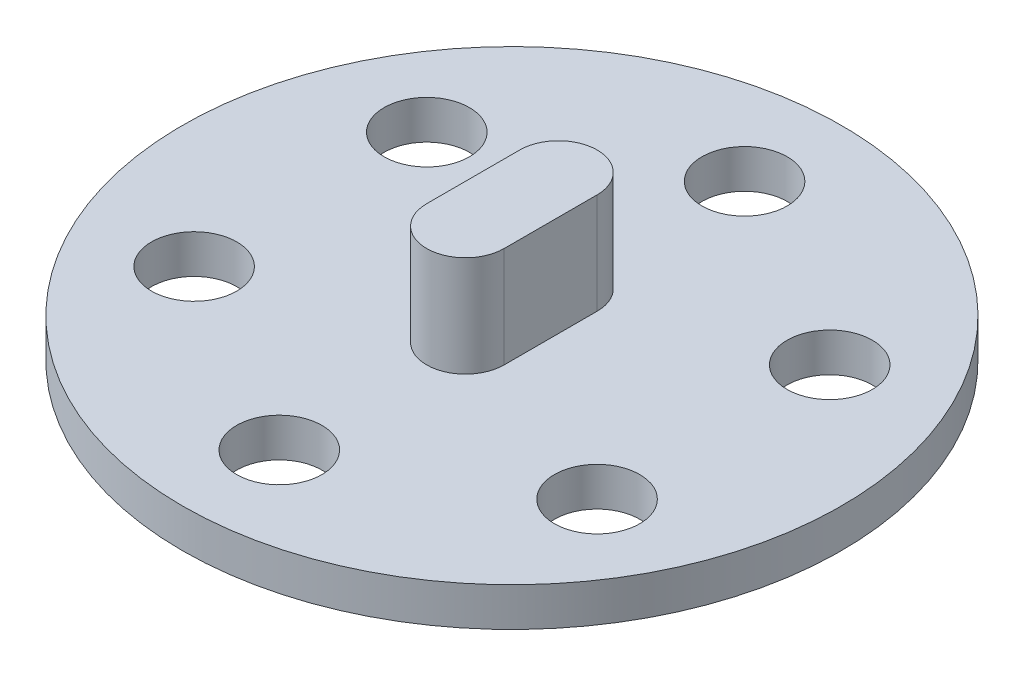
ISO-10303-21;
HEADER;
FILE_DESCRIPTION(('STEP AP214'),'2;1');
FILE_NAME('part.step','',(''),(''),'','','');
FILE_SCHEMA(('AUTOMOTIVE_DESIGN { 1 0 10303 214 1 1 1 1 }'));
ENDSEC;
DATA;
#1=APPLICATION_CONTEXT('core data for automotive mechanical design processes');
#2=APPLICATION_PROTOCOL_DEFINITION('international standard','automotive_design',2000,#1);
#3=PRODUCT_CONTEXT('',#1,'mechanical');
#4=PRODUCT('Part','Part','',(#3));
#5=PRODUCT_RELATED_PRODUCT_CATEGORY('part','',(#4));
#6=PRODUCT_DEFINITION_FORMATION('','',#4);
#7=PRODUCT_DEFINITION_CONTEXT('part definition',#1,'design');
#8=PRODUCT_DEFINITION('design','',#6,#7);
#9=PRODUCT_DEFINITION_SHAPE('','',#8);
#10=(LENGTH_UNIT() NAMED_UNIT(*) SI_UNIT(.MILLI.,.METRE.));
#11=(NAMED_UNIT(*) PLANE_ANGLE_UNIT() SI_UNIT($,.RADIAN.));
#12=(NAMED_UNIT(*) SI_UNIT($,.STERADIAN.) SOLID_ANGLE_UNIT());
#13=UNCERTAINTY_MEASURE_WITH_UNIT(LENGTH_MEASURE(1.E-05),#10,'distance_accuracy_value','');
#14=(GEOMETRIC_REPRESENTATION_CONTEXT(3) GLOBAL_UNCERTAINTY_ASSIGNED_CONTEXT((#13)) GLOBAL_UNIT_ASSIGNED_CONTEXT((#10,
#11,#12)) REPRESENTATION_CONTEXT('',''));
#15=CARTESIAN_POINT('',(0.,0.,0.));
#16=DIRECTION('',(0.,0.,1.));
#17=DIRECTION('',(1.,0.,0.));
#18=AXIS2_PLACEMENT_3D('',#15,#16,#17);
#19=CARTESIAN_POINT('',(0.,5.,0.));
#20=DIRECTION('',(0.,1.,0.));
#21=DIRECTION('',(0.,0.,1.));
#22=AXIS2_PLACEMENT_3D('',#19,#20,#21);
#23=PLANE('',#22);
#24=CARTESIAN_POINT('',(3.61340512615863E-12,5.,29.9999999999973));
#25=DIRECTION('',(0.,1.,0.));
#26=DIRECTION('',(0.,0.,1.));
#27=AXIS2_PLACEMENT_3D('',#24,#25,#26);
#28=CIRCLE('',#27,5.5);
#29=CARTESIAN_POINT('',(3.61340512615863E-12,5.,35.4999999999973));
#30=VERTEX_POINT('',#29);
#31=EDGE_CURVE('E141',#30,#30,#28,.T.);
#32=ORIENTED_EDGE('',*,*,#31,.F.);
#33=EDGE_LOOP('',(#32));
#34=FACE_BOUND('',#33,.T.);
#35=CARTESIAN_POINT('',(25.9807621135322,5.,-15.0000000000036));
#36=DIRECTION('',(0.,1.,0.));
#37=DIRECTION('',(0.,0.,1.));
#38=AXIS2_PLACEMENT_3D('',#35,#36,#37);
#39=CIRCLE('',#38,5.5);
#40=CARTESIAN_POINT('',(25.9807621135322,5.,-9.50000000000357));
#41=VERTEX_POINT('',#40);
#42=EDGE_CURVE('E157',#41,#41,#39,.T.);
#43=ORIENTED_EDGE('',*,*,#42,.F.);
#44=EDGE_LOOP('',(#43));
#45=FACE_BOUND('',#44,.T.);
#46=CARTESIAN_POINT('',(-25.9807621135326,5.,-14.9999999999996));
#47=DIRECTION('',(0.,1.,0.));
#48=DIRECTION('',(0.,0.,1.));
#49=AXIS2_PLACEMENT_3D('',#46,#47,#48);
#50=CIRCLE('',#49,5.5);
#51=CARTESIAN_POINT('',(-25.9807621135326,5.,-9.49999999999957));
#52=VERTEX_POINT('',#51);
#53=EDGE_CURVE('E173',#52,#52,#50,.T.);
#54=ORIENTED_EDGE('',*,*,#53,.F.);
#55=EDGE_LOOP('',(#54));
#56=FACE_BOUND('',#55,.T.);
#57=CARTESIAN_POINT('',(0.,5.,0.));
#58=DIRECTION('',(0.,1.,0.));
#59=DIRECTION('',(0.,0.,1.));
#60=AXIS2_PLACEMENT_3D('',#57,#58,#59);
#61=CIRCLE('',#60,42.5);
#62=CARTESIAN_POINT('',(0.,5.,42.5));
#63=VERTEX_POINT('',#62);
#64=EDGE_CURVE('E11',#63,#63,#61,.T.);
#65=ORIENTED_EDGE('',*,*,#64,.T.);
#66=EDGE_LOOP('',(#65));
#67=FACE_BOUND('',#66,.T.);
#68=CARTESIAN_POINT('',(-1.44883492865421E-12,5.,-30.0000000000009));
#69=DIRECTION('',(0.,1.,0.));
#70=DIRECTION('',(0.,0.,1.));
#71=AXIS2_PLACEMENT_3D('',#68,#69,#70);
#72=CIRCLE('',#71,5.5);
#73=CARTESIAN_POINT('',(-1.44883492865421E-12,5.,-24.5000000000009));
#74=VERTEX_POINT('',#73);
#75=EDGE_CURVE('E165',#74,#74,#72,.T.);
#76=ORIENTED_EDGE('',*,*,#75,.F.);
#77=EDGE_LOOP('',(#76));
#78=FACE_BOUND('',#77,.T.);
#79=CARTESIAN_POINT('',(25.9807621135347,5.,14.9999999999955));
#80=DIRECTION('',(0.,1.,0.));
#81=DIRECTION('',(0.,0.,1.));
#82=AXIS2_PLACEMENT_3D('',#79,#80,#81);
#83=CIRCLE('',#82,5.5);
#84=CARTESIAN_POINT('',(25.9807621135347,5.,20.4999999999955));
#85=VERTEX_POINT('',#84);
#86=EDGE_CURVE('E149',#85,#85,#83,.T.);
#87=ORIENTED_EDGE('',*,*,#86,.F.);
#88=EDGE_LOOP('',(#87));
#89=FACE_BOUND('',#88,.T.);
#90=CARTESIAN_POINT('',(-25.98076211353,5.,14.9999999999999));
#91=DIRECTION('',(0.,1.,0.));
#92=DIRECTION('',(0.,0.,1.));
#93=AXIS2_PLACEMENT_3D('',#90,#91,#92);
#94=CIRCLE('',#93,5.5);
#95=CARTESIAN_POINT('',(-25.98076211353,5.,20.4999999999999));
#96=VERTEX_POINT('',#95);
#97=EDGE_CURVE('E133',#96,#96,#94,.T.);
#98=ORIENTED_EDGE('',*,*,#97,.F.);
#99=EDGE_LOOP('',(#98));
#100=FACE_BOUND('',#99,.T.);
#101=DIRECTION('',(0.,0.,-1.));
#102=VECTOR('',#101,1.);
#103=CARTESIAN_POINT('',(5.,5.,6.));
#104=LINE('',#103,#102);
#105=CARTESIAN_POINT('',(5.,5.,6.));
#106=VERTEX_POINT('',#105);
#107=CARTESIAN_POINT('',(4.99999999999999,5.,-6.));
#108=VERTEX_POINT('',#107);
#109=EDGE_CURVE('E101',#106,#108,#104,.T.);
#110=ORIENTED_EDGE('',*,*,#109,.F.);
#111=CARTESIAN_POINT('',(0.,5.,6.));
#112=DIRECTION('',(0.,1.,0.));
#113=DIRECTION('',(0.,0.,1.));
#114=AXIS2_PLACEMENT_3D('',#111,#112,#113);
#115=CIRCLE('',#114,5.);
#116=CARTESIAN_POINT('',(-5.,5.,6.));
#117=VERTEX_POINT('',#116);
#118=EDGE_CURVE('E115',#117,#106,#115,.T.);
#119=ORIENTED_EDGE('',*,*,#118,.F.);
#120=DIRECTION('',(0.,0.,1.));
#121=VECTOR('',#120,1.);
#122=CARTESIAN_POINT('',(-5.,5.,6.));
#123=LINE('',#122,#121);
#124=CARTESIAN_POINT('',(-5.,5.,-6.));
#125=VERTEX_POINT('',#124);
#126=EDGE_CURVE('E81',#125,#117,#123,.T.);
#127=ORIENTED_EDGE('',*,*,#126,.F.);
#128=CARTESIAN_POINT('',(0.,5.,-6.));
#129=DIRECTION('',(0.,1.,0.));
#130=DIRECTION('',(0.,0.,1.));
#131=AXIS2_PLACEMENT_3D('',#128,#129,#130);
#132=CIRCLE('',#131,5.);
#133=EDGE_CURVE('E121',#108,#125,#132,.T.);
#134=ORIENTED_EDGE('',*,*,#133,.F.);
#135=EDGE_LOOP('',(#110,#119,#127,#134));
#136=FACE_BOUND('',#135,.T.);
#137=ADVANCED_FACE('F43',(#34,#45,#56,#67,#78,#89,#100,#136),#23,.T.);
#138=CARTESIAN_POINT('',(0.,0.,0.));
#139=DIRECTION('',(0.,1.,0.));
#140=DIRECTION('',(0.,0.,1.));
#141=AXIS2_PLACEMENT_3D('',#138,#139,#140);
#142=PLANE('',#141);
#143=CARTESIAN_POINT('',(0.,0.,0.));
#144=DIRECTION('',(0.,1.,0.));
#145=DIRECTION('',(0.,0.,1.));
#146=AXIS2_PLACEMENT_3D('',#143,#144,#145);
#147=CIRCLE('',#146,42.5);
#148=CARTESIAN_POINT('',(0.,0.,42.5));
#149=VERTEX_POINT('',#148);
#150=EDGE_CURVE('E47',#149,#149,#147,.T.);
#151=ORIENTED_EDGE('',*,*,#150,.F.);
#152=EDGE_LOOP('',(#151));
#153=FACE_BOUND('',#152,.T.);
#154=CARTESIAN_POINT('',(-25.9807621135326,0.,-14.9999999999996));
#155=DIRECTION('',(0.,1.,0.));
#156=DIRECTION('',(0.,0.,1.));
#157=AXIS2_PLACEMENT_3D('',#154,#155,#156);
#158=CIRCLE('',#157,5.5);
#159=CARTESIAN_POINT('',(-25.9807621135326,0.,-9.49999999999957));
#160=VERTEX_POINT('',#159);
#161=EDGE_CURVE('E169',#160,#160,#158,.T.);
#162=ORIENTED_EDGE('',*,*,#161,.T.);
#163=EDGE_LOOP('',(#162));
#164=FACE_BOUND('',#163,.T.);
#165=CARTESIAN_POINT('',(-1.44883492865421E-12,0.,-30.0000000000009));
#166=DIRECTION('',(0.,1.,0.));
#167=DIRECTION('',(0.,0.,1.));
#168=AXIS2_PLACEMENT_3D('',#165,#166,#167);
#169=CIRCLE('',#168,5.5);
#170=CARTESIAN_POINT('',(-1.44883492865421E-12,0.,-24.5000000000009));
#171=VERTEX_POINT('',#170);
#172=EDGE_CURVE('E161',#171,#171,#169,.T.);
#173=ORIENTED_EDGE('',*,*,#172,.T.);
#174=EDGE_LOOP('',(#173));
#175=FACE_BOUND('',#174,.T.);
#176=CARTESIAN_POINT('',(25.9807621135322,0.,-15.0000000000036));
#177=DIRECTION('',(0.,1.,0.));
#178=DIRECTION('',(0.,0.,1.));
#179=AXIS2_PLACEMENT_3D('',#176,#177,#178);
#180=CIRCLE('',#179,5.5);
#181=CARTESIAN_POINT('',(25.9807621135322,0.,-9.50000000000357));
#182=VERTEX_POINT('',#181);
#183=EDGE_CURVE('E153',#182,#182,#180,.T.);
#184=ORIENTED_EDGE('',*,*,#183,.T.);
#185=EDGE_LOOP('',(#184));
#186=FACE_BOUND('',#185,.T.);
#187=CARTESIAN_POINT('',(25.9807621135347,0.,14.9999999999955));
#188=DIRECTION('',(0.,1.,0.));
#189=DIRECTION('',(0.,0.,1.));
#190=AXIS2_PLACEMENT_3D('',#187,#188,#189);
#191=CIRCLE('',#190,5.5);
#192=CARTESIAN_POINT('',(25.9807621135347,0.,20.4999999999955));
#193=VERTEX_POINT('',#192);
#194=EDGE_CURVE('E145',#193,#193,#191,.T.);
#195=ORIENTED_EDGE('',*,*,#194,.T.);
#196=EDGE_LOOP('',(#195));
#197=FACE_BOUND('',#196,.T.);
#198=CARTESIAN_POINT('',(3.61340512615863E-12,0.,29.9999999999973));
#199=DIRECTION('',(0.,1.,0.));
#200=DIRECTION('',(0.,0.,1.));
#201=AXIS2_PLACEMENT_3D('',#198,#199,#200);
#202=CIRCLE('',#201,5.5);
#203=CARTESIAN_POINT('',(3.61340512615863E-12,0.,35.4999999999973));
#204=VERTEX_POINT('',#203);
#205=EDGE_CURVE('E137',#204,#204,#202,.T.);
#206=ORIENTED_EDGE('',*,*,#205,.T.);
#207=EDGE_LOOP('',(#206));
#208=FACE_BOUND('',#207,.T.);
#209=CARTESIAN_POINT('',(-25.98076211353,0.,14.9999999999999));
#210=DIRECTION('',(0.,1.,0.));
#211=DIRECTION('',(0.,0.,1.));
#212=AXIS2_PLACEMENT_3D('',#209,#210,#211);
#213=CIRCLE('',#212,5.5);
#214=CARTESIAN_POINT('',(-25.98076211353,0.,20.4999999999999));
#215=VERTEX_POINT('',#214);
#216=EDGE_CURVE('E132',#215,#215,#213,.T.);
#217=ORIENTED_EDGE('',*,*,#216,.T.);
#218=EDGE_LOOP('',(#217));
#219=FACE_BOUND('',#218,.T.);
#220=ADVANCED_FACE('F181',(#153,#164,#175,#186,#197,#208,#219),#142,.F.);
#221=CARTESIAN_POINT('',(0.,5.,0.));
#222=DIRECTION('',(0.,-1.,0.));
#223=DIRECTION('',(0.,0.,-1.));
#224=AXIS2_PLACEMENT_3D('',#221,#222,#223);
#225=CYLINDRICAL_SURFACE('',#224,42.5);
#226=ORIENTED_EDGE('',*,*,#64,.F.);
#227=EDGE_LOOP('',(#226));
#228=FACE_BOUND('',#227,.T.);
#229=ORIENTED_EDGE('',*,*,#150,.T.);
#230=EDGE_LOOP('',(#229));
#231=FACE_BOUND('',#230,.T.);
#232=ADVANCED_FACE('F45',(#228,#231),#225,.T.);
#233=CARTESIAN_POINT('',(-25.9807621135326,5.,-14.9999999999996));
#234=DIRECTION('',(0.,-1.,0.));
#235=DIRECTION('',(0.,0.,-1.));
#236=AXIS2_PLACEMENT_3D('',#233,#234,#235);
#237=CYLINDRICAL_SURFACE('',#236,5.5);
#238=ORIENTED_EDGE('',*,*,#53,.T.);
#239=EDGE_LOOP('',(#238));
#240=FACE_BOUND('',#239,.T.);
#241=ORIENTED_EDGE('',*,*,#161,.F.);
#242=EDGE_LOOP('',(#241));
#243=FACE_BOUND('',#242,.T.);
#244=ADVANCED_FACE('F184',(#240,#243),#237,.F.);
#245=CARTESIAN_POINT('',(-1.44883492865421E-12,5.,-30.0000000000009));
#246=DIRECTION('',(0.,-1.,0.));
#247=DIRECTION('',(0.,0.,-1.));
#248=AXIS2_PLACEMENT_3D('',#245,#246,#247);
#249=CYLINDRICAL_SURFACE('',#248,5.5);
#250=ORIENTED_EDGE('',*,*,#75,.T.);
#251=EDGE_LOOP('',(#250));
#252=FACE_BOUND('',#251,.T.);
#253=ORIENTED_EDGE('',*,*,#172,.F.);
#254=EDGE_LOOP('',(#253));
#255=FACE_BOUND('',#254,.T.);
#256=ADVANCED_FACE('F186',(#252,#255),#249,.F.);
#257=CARTESIAN_POINT('',(25.9807621135322,5.,-15.0000000000036));
#258=DIRECTION('',(0.,-1.,0.));
#259=DIRECTION('',(0.,0.,-1.));
#260=AXIS2_PLACEMENT_3D('',#257,#258,#259);
#261=CYLINDRICAL_SURFACE('',#260,5.5);
#262=ORIENTED_EDGE('',*,*,#42,.T.);
#263=EDGE_LOOP('',(#262));
#264=FACE_BOUND('',#263,.T.);
#265=ORIENTED_EDGE('',*,*,#183,.F.);
#266=EDGE_LOOP('',(#265));
#267=FACE_BOUND('',#266,.T.);
#268=ADVANCED_FACE('F193',(#264,#267),#261,.F.);
#269=CARTESIAN_POINT('',(25.9807621135347,5.,14.9999999999955));
#270=DIRECTION('',(0.,-1.,0.));
#271=DIRECTION('',(0.,0.,-1.));
#272=AXIS2_PLACEMENT_3D('',#269,#270,#271);
#273=CYLINDRICAL_SURFACE('',#272,5.5);
#274=ORIENTED_EDGE('',*,*,#86,.T.);
#275=EDGE_LOOP('',(#274));
#276=FACE_BOUND('',#275,.T.);
#277=ORIENTED_EDGE('',*,*,#194,.F.);
#278=EDGE_LOOP('',(#277));
#279=FACE_BOUND('',#278,.T.);
#280=ADVANCED_FACE('F242',(#276,#279),#273,.F.);
#281=CARTESIAN_POINT('',(3.61340512615863E-12,5.,29.9999999999973));
#282=DIRECTION('',(0.,-1.,0.));
#283=DIRECTION('',(0.,0.,-1.));
#284=AXIS2_PLACEMENT_3D('',#281,#282,#283);
#285=CYLINDRICAL_SURFACE('',#284,5.5);
#286=ORIENTED_EDGE('',*,*,#31,.T.);
#287=EDGE_LOOP('',(#286));
#288=FACE_BOUND('',#287,.T.);
#289=ORIENTED_EDGE('',*,*,#205,.F.);
#290=EDGE_LOOP('',(#289));
#291=FACE_BOUND('',#290,.T.);
#292=ADVANCED_FACE('F238',(#288,#291),#285,.F.);
#293=CARTESIAN_POINT('',(-25.98076211353,5.,14.9999999999999));
#294=DIRECTION('',(0.,-1.,0.));
#295=DIRECTION('',(0.,0.,-1.));
#296=AXIS2_PLACEMENT_3D('',#293,#294,#295);
#297=CYLINDRICAL_SURFACE('',#296,5.5);
#298=ORIENTED_EDGE('',*,*,#97,.T.);
#299=EDGE_LOOP('',(#298));
#300=FACE_BOUND('',#299,.T.);
#301=ORIENTED_EDGE('',*,*,#216,.F.);
#302=EDGE_LOOP('',(#301));
#303=FACE_BOUND('',#302,.T.);
#304=ADVANCED_FACE('F235',(#300,#303),#297,.F.);
#305=CARTESIAN_POINT('',(0.,18.,6.));
#306=DIRECTION('',(0.,-1.,0.));
#307=DIRECTION('',(0.,0.,-1.));
#308=AXIS2_PLACEMENT_3D('',#305,#306,#307);
#309=CYLINDRICAL_SURFACE('',#308,5.);
#310=ORIENTED_EDGE('',*,*,#118,.T.);
#311=DIRECTION('',(0.,-1.,0.));
#312=VECTOR('',#311,1.);
#313=CARTESIAN_POINT('',(5.,18.,6.));
#314=LINE('',#313,#312);
#315=CARTESIAN_POINT('',(5.,18.,6.));
#316=VERTEX_POINT('',#315);
#317=EDGE_CURVE('E105',#316,#106,#314,.T.);
#318=ORIENTED_EDGE('',*,*,#317,.F.);
#319=CARTESIAN_POINT('',(0.,18.,6.));
#320=DIRECTION('',(0.,1.,0.));
#321=DIRECTION('',(0.,0.,1.));
#322=AXIS2_PLACEMENT_3D('',#319,#320,#321);
#323=CIRCLE('',#322,5.);
#324=CARTESIAN_POINT('',(-5.,18.,6.));
#325=VERTEX_POINT('',#324);
#326=EDGE_CURVE('E93',#325,#316,#323,.T.);
#327=ORIENTED_EDGE('',*,*,#326,.F.);
#328=DIRECTION('',(0.,-1.,0.));
#329=VECTOR('',#328,1.);
#330=CARTESIAN_POINT('',(-5.,18.,6.));
#331=LINE('',#330,#329);
#332=EDGE_CURVE('E111',#325,#117,#331,.T.);
#333=ORIENTED_EDGE('',*,*,#332,.T.);
#334=EDGE_LOOP('',(#310,#318,#327,#333));
#335=FACE_BOUND('',#334,.T.);
#336=ADVANCED_FACE('F220',(#335),#309,.T.);
#337=CARTESIAN_POINT('',(5.,18.,6.));
#338=DIRECTION('',(-1.,0.,0.));
#339=DIRECTION('',(0.,0.,1.));
#340=AXIS2_PLACEMENT_3D('',#337,#338,#339);
#341=PLANE('',#340);
#342=ORIENTED_EDGE('',*,*,#109,.T.);
#343=DIRECTION('',(0.,-1.,0.));
#344=VECTOR('',#343,1.);
#345=CARTESIAN_POINT('',(4.99999999999999,18.,-6.));
#346=LINE('',#345,#344);
#347=CARTESIAN_POINT('',(4.99999999999999,18.,-6.));
#348=VERTEX_POINT('',#347);
#349=EDGE_CURVE('E98',#348,#108,#346,.T.);
#350=ORIENTED_EDGE('',*,*,#349,.F.);
#351=DIRECTION('',(0.,0.,-1.));
#352=VECTOR('',#351,1.);
#353=CARTESIAN_POINT('',(5.,18.,6.));
#354=LINE('',#353,#352);
#355=EDGE_CURVE('E88',#316,#348,#354,.T.);
#356=ORIENTED_EDGE('',*,*,#355,.F.);
#357=ORIENTED_EDGE('',*,*,#317,.T.);
#358=EDGE_LOOP('',(#342,#350,#356,#357));
#359=FACE_BOUND('',#358,.T.);
#360=ADVANCED_FACE('F99',(#359),#341,.F.);
#361=CARTESIAN_POINT('',(0.,18.,-6.));
#362=DIRECTION('',(0.,-1.,0.));
#363=DIRECTION('',(0.,0.,-1.));
#364=AXIS2_PLACEMENT_3D('',#361,#362,#363);
#365=CYLINDRICAL_SURFACE('',#364,5.);
#366=ORIENTED_EDGE('',*,*,#133,.T.);
#367=DIRECTION('',(0.,-1.,0.));
#368=VECTOR('',#367,1.);
#369=CARTESIAN_POINT('',(-5.,18.,-6.));
#370=LINE('',#369,#368);
#371=CARTESIAN_POINT('',(-5.,18.,-6.));
#372=VERTEX_POINT('',#371);
#373=EDGE_CURVE('E59',#372,#125,#370,.T.);
#374=ORIENTED_EDGE('',*,*,#373,.F.);
#375=CARTESIAN_POINT('',(0.,18.,-6.));
#376=DIRECTION('',(0.,1.,0.));
#377=DIRECTION('',(0.,0.,1.));
#378=AXIS2_PLACEMENT_3D('',#375,#376,#377);
#379=CIRCLE('',#378,5.);
#380=EDGE_CURVE('E91',#348,#372,#379,.T.);
#381=ORIENTED_EDGE('',*,*,#380,.F.);
#382=ORIENTED_EDGE('',*,*,#349,.T.);
#383=EDGE_LOOP('',(#366,#374,#381,#382));
#384=FACE_BOUND('',#383,.T.);
#385=ADVANCED_FACE('F107',(#384),#365,.T.);
#386=CARTESIAN_POINT('',(-5.,18.,6.));
#387=DIRECTION('',(1.,0.,0.));
#388=DIRECTION('',(0.,0.,-1.));
#389=AXIS2_PLACEMENT_3D('',#386,#387,#388);
#390=PLANE('',#389);
#391=ORIENTED_EDGE('',*,*,#126,.T.);
#392=ORIENTED_EDGE('',*,*,#332,.F.);
#393=DIRECTION('',(0.,0.,1.));
#394=VECTOR('',#393,1.);
#395=CARTESIAN_POINT('',(-5.,18.,6.));
#396=LINE('',#395,#394);
#397=EDGE_CURVE('E67',#372,#325,#396,.T.);
#398=ORIENTED_EDGE('',*,*,#397,.F.);
#399=ORIENTED_EDGE('',*,*,#373,.T.);
#400=EDGE_LOOP('',(#391,#392,#398,#399));
#401=FACE_BOUND('',#400,.T.);
#402=ADVANCED_FACE('F221',(#401),#390,.F.);
#403=CARTESIAN_POINT('',(0.,18.,6.));
#404=DIRECTION('',(0.,1.,0.));
#405=DIRECTION('',(0.,0.,1.));
#406=AXIS2_PLACEMENT_3D('',#403,#404,#405);
#407=PLANE('',#406);
#408=ORIENTED_EDGE('',*,*,#326,.T.);
#409=ORIENTED_EDGE('',*,*,#355,.T.);
#410=ORIENTED_EDGE('',*,*,#380,.T.);
#411=ORIENTED_EDGE('',*,*,#397,.T.);
#412=EDGE_LOOP('',(#408,#409,#410,#411));
#413=FACE_BOUND('',#412,.T.);
#414=ADVANCED_FACE('F89',(#413),#407,.T.);
#415=CLOSED_SHELL('',(#137,#220,#232,#244,#256,#268,#280,#292,#304,#336,#360,#385,#402,#414));
#416=MANIFOLD_SOLID_BREP('B2',#415);
#417=ADVANCED_BREP_SHAPE_REPRESENTATION('',(#18,#416),#14);
#418=SHAPE_DEFINITION_REPRESENTATION(#9,#417);
ENDSEC;
END-ISO-10303-21;
